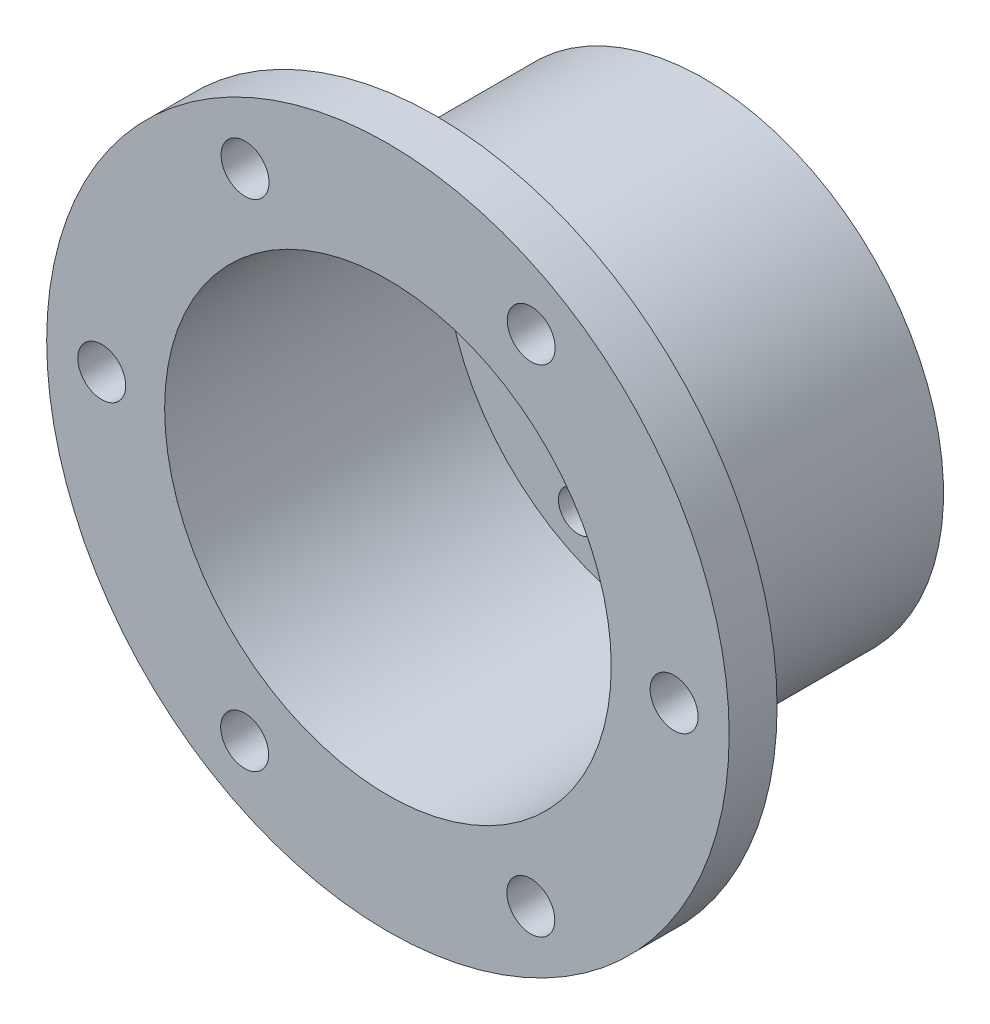
ISO-10303-21;
HEADER;
FILE_DESCRIPTION(('STEP AP214'),'2;1');
FILE_NAME('part.step','',(''),(''),'','','');
FILE_SCHEMA(('AUTOMOTIVE_DESIGN { 1 0 10303 214 1 1 1 1 }'));
ENDSEC;
DATA;
#1=APPLICATION_CONTEXT('core data for automotive mechanical design processes');
#2=APPLICATION_PROTOCOL_DEFINITION('international standard','automotive_design',2000,#1);
#3=PRODUCT_CONTEXT('',#1,'mechanical');
#4=PRODUCT('Part','Part','',(#3));
#5=PRODUCT_RELATED_PRODUCT_CATEGORY('part','',(#4));
#6=PRODUCT_DEFINITION_FORMATION('','',#4);
#7=PRODUCT_DEFINITION_CONTEXT('part definition',#1,'design');
#8=PRODUCT_DEFINITION('design','',#6,#7);
#9=PRODUCT_DEFINITION_SHAPE('','',#8);
#10=(LENGTH_UNIT() NAMED_UNIT(*) SI_UNIT(.MILLI.,.METRE.));
#11=(NAMED_UNIT(*) PLANE_ANGLE_UNIT() SI_UNIT($,.RADIAN.));
#12=(NAMED_UNIT(*) SI_UNIT($,.STERADIAN.) SOLID_ANGLE_UNIT());
#13=UNCERTAINTY_MEASURE_WITH_UNIT(LENGTH_MEASURE(1.E-05),#10,'distance_accuracy_value','');
#14=(GEOMETRIC_REPRESENTATION_CONTEXT(3) GLOBAL_UNCERTAINTY_ASSIGNED_CONTEXT((#13)) GLOBAL_UNIT_ASSIGNED_CONTEXT((#10,
#11,#12)) REPRESENTATION_CONTEXT('',''));
#15=CARTESIAN_POINT('',(0.,0.,0.));
#16=DIRECTION('',(0.,0.,1.));
#17=DIRECTION('',(1.,0.,0.));
#18=AXIS2_PLACEMENT_3D('',#15,#16,#17);
#19=CARTESIAN_POINT('',(0.,0.,0.));
#20=DIRECTION('',(0.,0.,1.));
#21=DIRECTION('',(1.,0.,0.));
#22=AXIS2_PLACEMENT_3D('',#19,#20,#21);
#23=PLANE('',#22);
#24=CARTESIAN_POINT('',(0.,-7.,0.));
#25=DIRECTION('',(0.,0.,-1.));
#26=DIRECTION('',(-1.,0.,0.));
#27=AXIS2_PLACEMENT_3D('',#24,#25,#26);
#28=CIRCLE('',#27,6.15);
#29=CARTESIAN_POINT('',(-6.15,-7.,0.));
#30=VERTEX_POINT('',#29);
#31=EDGE_CURVE('E78',#30,#30,#28,.T.);
#32=ORIENTED_EDGE('',*,*,#31,.F.);
#33=EDGE_LOOP('',(#32));
#34=FACE_BOUND('',#33,.T.);
#35=CARTESIAN_POINT('',(15.4976392749241,0.270512299777895,0.));
#36=DIRECTION('',(0.,0.,-1.));
#37=DIRECTION('',(-1.,0.,0.));
#38=AXIS2_PLACEMENT_3D('',#35,#36,#37);
#39=CIRCLE('',#38,1.65);
#40=CARTESIAN_POINT('',(13.8476392749241,0.270512299777895,0.));
#41=VERTEX_POINT('',#40);
#42=EDGE_CURVE('E113',#41,#41,#39,.T.);
#43=ORIENTED_EDGE('',*,*,#42,.F.);
#44=EDGE_LOOP('',(#43));
#45=FACE_BOUND('',#44,.T.);
#46=CARTESIAN_POINT('',(7.51454911381823,13.5566054606606,0.));
#47=DIRECTION('',(0.,0.,-1.));
#48=DIRECTION('',(-1.,0.,0.));
#49=AXIS2_PLACEMENT_3D('',#46,#47,#48);
#50=CIRCLE('',#49,1.65);
#51=CARTESIAN_POINT('',(5.86454911381823,13.5566054606606,0.));
#52=VERTEX_POINT('',#51);
#53=EDGE_CURVE('E107',#52,#52,#50,.T.);
#54=ORIENTED_EDGE('',*,*,#53,.F.);
#55=EDGE_LOOP('',(#54));
#56=FACE_BOUND('',#55,.T.);
#57=CARTESIAN_POINT('',(-7.98309016110584,13.2860931608827,0.));
#58=DIRECTION('',(0.,0.,-1.));
#59=DIRECTION('',(-1.,0.,0.));
#60=AXIS2_PLACEMENT_3D('',#57,#58,#59);
#61=CIRCLE('',#60,1.65);
#62=CARTESIAN_POINT('',(-9.63309016110584,13.2860931608827,0.));
#63=VERTEX_POINT('',#62);
#64=EDGE_CURVE('E101',#63,#63,#61,.T.);
#65=ORIENTED_EDGE('',*,*,#64,.F.);
#66=EDGE_LOOP('',(#65));
#67=FACE_BOUND('',#66,.T.);
#68=CARTESIAN_POINT('',(-15.4976392749241,-0.270512299777893,0.));
#69=DIRECTION('',(0.,0.,-1.));
#70=DIRECTION('',(-1.,0.,0.));
#71=AXIS2_PLACEMENT_3D('',#68,#69,#70);
#72=CIRCLE('',#71,1.65);
#73=CARTESIAN_POINT('',(-17.1476392749241,-0.270512299777893,0.));
#74=VERTEX_POINT('',#73);
#75=EDGE_CURVE('E95',#74,#74,#72,.T.);
#76=ORIENTED_EDGE('',*,*,#75,.F.);
#77=EDGE_LOOP('',(#76));
#78=FACE_BOUND('',#77,.T.);
#79=CARTESIAN_POINT('',(-7.51454911381823,-13.5566054606606,0.));
#80=DIRECTION('',(0.,0.,-1.));
#81=DIRECTION('',(-1.,0.,0.));
#82=AXIS2_PLACEMENT_3D('',#79,#80,#81);
#83=CIRCLE('',#82,1.65);
#84=CARTESIAN_POINT('',(-9.16454911381823,-13.5566054606606,0.));
#85=VERTEX_POINT('',#84);
#86=EDGE_CURVE('E89',#85,#85,#83,.T.);
#87=ORIENTED_EDGE('',*,*,#86,.F.);
#88=EDGE_LOOP('',(#87));
#89=FACE_BOUND('',#88,.T.);
#90=CARTESIAN_POINT('',(7.98309016110583,-13.2860931608827,0.));
#91=DIRECTION('',(0.,0.,-1.));
#92=DIRECTION('',(-1.,0.,0.));
#93=AXIS2_PLACEMENT_3D('',#90,#91,#92);
#94=CIRCLE('',#93,1.65);
#95=CARTESIAN_POINT('',(6.33309016110583,-13.2860931608827,0.));
#96=VERTEX_POINT('',#95);
#97=EDGE_CURVE('E52',#96,#96,#94,.T.);
#98=ORIENTED_EDGE('',*,*,#97,.F.);
#99=EDGE_LOOP('',(#98));
#100=FACE_BOUND('',#99,.T.);
#101=CARTESIAN_POINT('',(0.,0.,0.));
#102=DIRECTION('',(0.,0.,-1.));
#103=DIRECTION('',(-1.,0.,0.));
#104=AXIS2_PLACEMENT_3D('',#101,#102,#103);
#105=CIRCLE('',#104,20.);
#106=CARTESIAN_POINT('',(-20.,0.,0.));
#107=VERTEX_POINT('',#106);
#108=EDGE_CURVE('E125',#107,#107,#105,.T.);
#109=ORIENTED_EDGE('',*,*,#108,.T.);
#110=EDGE_LOOP('',(#109));
#111=FACE_BOUND('',#110,.T.);
#112=ADVANCED_FACE('F31',(#34,#45,#56,#67,#78,#89,#100,#111),#23,.F.);
#113=CARTESIAN_POINT('',(0.,0.,26.4));
#114=DIRECTION('',(0.,0.,-1.));
#115=DIRECTION('',(-1.,0.,0.));
#116=AXIS2_PLACEMENT_3D('',#113,#114,#115);
#117=CYLINDRICAL_SURFACE('',#116,18.65);
#118=CARTESIAN_POINT('',(0.,0.,26.4));
#119=DIRECTION('',(0.,0.,1.));
#120=DIRECTION('',(1.,0.,0.));
#121=AXIS2_PLACEMENT_3D('',#118,#119,#120);
#122=CIRCLE('',#121,18.65);
#123=CARTESIAN_POINT('',(18.65,0.,26.4));
#124=VERTEX_POINT('',#123);
#125=EDGE_CURVE('E42',#124,#124,#122,.T.);
#126=ORIENTED_EDGE('',*,*,#125,.T.);
#127=EDGE_LOOP('',(#126));
#128=FACE_BOUND('',#127,.T.);
#129=CARTESIAN_POINT('',(0.,0.,3.));
#130=DIRECTION('',(0.,0.,-1.));
#131=DIRECTION('',(-1.,0.,0.));
#132=AXIS2_PLACEMENT_3D('',#129,#130,#131);
#133=CIRCLE('',#132,18.65);
#134=CARTESIAN_POINT('',(-18.65,0.,3.));
#135=VERTEX_POINT('',#134);
#136=EDGE_CURVE('E46',#135,#135,#133,.T.);
#137=ORIENTED_EDGE('',*,*,#136,.T.);
#138=EDGE_LOOP('',(#137));
#139=FACE_BOUND('',#138,.T.);
#140=ADVANCED_FACE('F156',(#128,#139),#117,.F.);
#141=CARTESIAN_POINT('',(0.,0.,26.4));
#142=DIRECTION('',(0.,0.,1.));
#143=DIRECTION('',(1.,0.,0.));
#144=AXIS2_PLACEMENT_3D('',#141,#142,#143);
#145=PLANE('',#144);
#146=CARTESIAN_POINT('',(-23.8999999999988,0.0193012928345112,26.4));
#147=DIRECTION('',(0.,0.,1.));
#148=DIRECTION('',(1.,0.,0.));
#149=AXIS2_PLACEMENT_3D('',#146,#147,#148);
#150=CIRCLE('',#149,2.);
#151=CARTESIAN_POINT('',(-21.8999999999988,0.0193012928345112,26.4));
#152=VERTEX_POINT('',#151);
#153=EDGE_CURVE('E121',#152,#152,#150,.T.);
#154=ORIENTED_EDGE('',*,*,#153,.F.);
#155=EDGE_LOOP('',(#154));
#156=FACE_BOUND('',#155,.T.);
#157=CARTESIAN_POINT('',(-11.9667154099194,-20.6883565040301,26.4));
#158=DIRECTION('',(0.,0.,1.));
#159=DIRECTION('',(1.,0.,0.));
#160=AXIS2_PLACEMENT_3D('',#157,#158,#159);
#161=CIRCLE('',#160,2.);
#162=CARTESIAN_POINT('',(-9.96671540991937,-20.6883565040301,26.4));
#163=VERTEX_POINT('',#162);
#164=EDGE_CURVE('E124',#163,#163,#161,.T.);
#165=ORIENTED_EDGE('',*,*,#164,.F.);
#166=EDGE_LOOP('',(#165));
#167=FACE_BOUND('',#166,.T.);
#168=CARTESIAN_POINT('',(11.93328459008,-20.7076577968643,26.4));
#169=DIRECTION('',(0.,0.,1.));
#170=DIRECTION('',(1.,0.,0.));
#171=AXIS2_PLACEMENT_3D('',#168,#169,#170);
#172=CIRCLE('',#171,2.);
#173=CARTESIAN_POINT('',(13.93328459008,-20.7076577968643,26.4));
#174=VERTEX_POINT('',#173);
#175=EDGE_CURVE('E128',#174,#174,#172,.T.);
#176=ORIENTED_EDGE('',*,*,#175,.F.);
#177=EDGE_LOOP('',(#176));
#178=FACE_BOUND('',#177,.T.);
#179=CARTESIAN_POINT('',(23.9,-0.019301292833822,26.4));
#180=DIRECTION('',(0.,0.,1.));
#181=DIRECTION('',(1.,0.,0.));
#182=AXIS2_PLACEMENT_3D('',#179,#180,#181);
#183=CIRCLE('',#182,2.);
#184=CARTESIAN_POINT('',(25.9,-0.019301292833822,26.4));
#185=VERTEX_POINT('',#184);
#186=EDGE_CURVE('E131',#185,#185,#183,.T.);
#187=ORIENTED_EDGE('',*,*,#186,.F.);
#188=EDGE_LOOP('',(#187));
#189=FACE_BOUND('',#188,.T.);
#190=CARTESIAN_POINT('',(11.9667154099206,20.6883565040308,26.4));
#191=DIRECTION('',(0.,0.,1.));
#192=DIRECTION('',(1.,0.,0.));
#193=AXIS2_PLACEMENT_3D('',#190,#191,#192);
#194=CIRCLE('',#193,2.);
#195=CARTESIAN_POINT('',(13.9667154099206,20.6883565040308,26.4));
#196=VERTEX_POINT('',#195);
#197=EDGE_CURVE('E120',#196,#196,#194,.T.);
#198=ORIENTED_EDGE('',*,*,#197,.F.);
#199=EDGE_LOOP('',(#198));
#200=FACE_BOUND('',#199,.T.);
#201=CARTESIAN_POINT('',(-11.9332845900788,20.707657796865,26.4));
#202=DIRECTION('',(0.,0.,1.));
#203=DIRECTION('',(1.,0.,0.));
#204=AXIS2_PLACEMENT_3D('',#201,#202,#203);
#205=CIRCLE('',#204,2.);
#206=CARTESIAN_POINT('',(-9.93328459007882,20.707657796865,26.4));
#207=VERTEX_POINT('',#206);
#208=EDGE_CURVE('E67',#207,#207,#205,.T.);
#209=ORIENTED_EDGE('',*,*,#208,.F.);
#210=EDGE_LOOP('',(#209));
#211=FACE_BOUND('',#210,.T.);
#212=ORIENTED_EDGE('',*,*,#125,.F.);
#213=EDGE_LOOP('',(#212));
#214=FACE_BOUND('',#213,.T.);
#215=CARTESIAN_POINT('',(0.,0.,26.4));
#216=DIRECTION('',(0.,0.,1.));
#217=DIRECTION('',(1.,0.,0.));
#218=AXIS2_PLACEMENT_3D('',#215,#216,#217);
#219=CIRCLE('',#218,28.5);
#220=CARTESIAN_POINT('',(28.5,0.,26.4));
#221=VERTEX_POINT('',#220);
#222=EDGE_CURVE('E72',#221,#221,#219,.T.);
#223=ORIENTED_EDGE('',*,*,#222,.T.);
#224=EDGE_LOOP('',(#223));
#225=FACE_BOUND('',#224,.T.);
#226=ADVANCED_FACE('F161',(#156,#167,#178,#189,#200,#211,#214,#225),#145,.T.);
#227=CARTESIAN_POINT('',(0.,0.,3.));
#228=DIRECTION('',(0.,0.,-1.));
#229=DIRECTION('',(-1.,0.,0.));
#230=AXIS2_PLACEMENT_3D('',#227,#228,#229);
#231=PLANE('',#230);
#232=CARTESIAN_POINT('',(7.98309016110583,-13.2860931608827,3.));
#233=DIRECTION('',(0.,0.,-1.));
#234=DIRECTION('',(-1.,0.,0.));
#235=AXIS2_PLACEMENT_3D('',#232,#233,#234);
#236=CIRCLE('',#235,1.65);
#237=CARTESIAN_POINT('',(6.33309016110583,-13.2860931608827,3.));
#238=VERTEX_POINT('',#237);
#239=EDGE_CURVE('E86',#238,#238,#236,.T.);
#240=ORIENTED_EDGE('',*,*,#239,.T.);
#241=EDGE_LOOP('',(#240));
#242=FACE_BOUND('',#241,.T.);
#243=CARTESIAN_POINT('',(-7.51454911381823,-13.5566054606606,3.));
#244=DIRECTION('',(0.,0.,-1.));
#245=DIRECTION('',(-1.,0.,0.));
#246=AXIS2_PLACEMENT_3D('',#243,#244,#245);
#247=CIRCLE('',#246,1.65);
#248=CARTESIAN_POINT('',(-9.16454911381823,-13.5566054606606,3.));
#249=VERTEX_POINT('',#248);
#250=EDGE_CURVE('E92',#249,#249,#247,.T.);
#251=ORIENTED_EDGE('',*,*,#250,.T.);
#252=EDGE_LOOP('',(#251));
#253=FACE_BOUND('',#252,.T.);
#254=CARTESIAN_POINT('',(-15.4976392749241,-0.270512299777893,3.));
#255=DIRECTION('',(0.,0.,-1.));
#256=DIRECTION('',(-1.,0.,0.));
#257=AXIS2_PLACEMENT_3D('',#254,#255,#256);
#258=CIRCLE('',#257,1.65);
#259=CARTESIAN_POINT('',(-17.1476392749241,-0.270512299777893,3.));
#260=VERTEX_POINT('',#259);
#261=EDGE_CURVE('E98',#260,#260,#258,.T.);
#262=ORIENTED_EDGE('',*,*,#261,.T.);
#263=EDGE_LOOP('',(#262));
#264=FACE_BOUND('',#263,.T.);
#265=CARTESIAN_POINT('',(-7.98309016110584,13.2860931608827,3.));
#266=DIRECTION('',(0.,0.,-1.));
#267=DIRECTION('',(-1.,0.,0.));
#268=AXIS2_PLACEMENT_3D('',#265,#266,#267);
#269=CIRCLE('',#268,1.65);
#270=CARTESIAN_POINT('',(-9.63309016110584,13.2860931608827,3.));
#271=VERTEX_POINT('',#270);
#272=EDGE_CURVE('E104',#271,#271,#269,.T.);
#273=ORIENTED_EDGE('',*,*,#272,.T.);
#274=EDGE_LOOP('',(#273));
#275=FACE_BOUND('',#274,.T.);
#276=CARTESIAN_POINT('',(7.51454911381823,13.5566054606606,3.));
#277=DIRECTION('',(0.,0.,-1.));
#278=DIRECTION('',(-1.,0.,0.));
#279=AXIS2_PLACEMENT_3D('',#276,#277,#278);
#280=CIRCLE('',#279,1.65);
#281=CARTESIAN_POINT('',(5.86454911381823,13.5566054606606,3.));
#282=VERTEX_POINT('',#281);
#283=EDGE_CURVE('E110',#282,#282,#280,.T.);
#284=ORIENTED_EDGE('',*,*,#283,.T.);
#285=EDGE_LOOP('',(#284));
#286=FACE_BOUND('',#285,.T.);
#287=CARTESIAN_POINT('',(15.4976392749241,0.270512299777895,3.));
#288=DIRECTION('',(0.,0.,-1.));
#289=DIRECTION('',(-1.,0.,0.));
#290=AXIS2_PLACEMENT_3D('',#287,#288,#289);
#291=CIRCLE('',#290,1.65);
#292=CARTESIAN_POINT('',(13.8476392749241,0.270512299777895,3.));
#293=VERTEX_POINT('',#292);
#294=EDGE_CURVE('E81',#293,#293,#291,.T.);
#295=ORIENTED_EDGE('',*,*,#294,.T.);
#296=EDGE_LOOP('',(#295));
#297=FACE_BOUND('',#296,.T.);
#298=CARTESIAN_POINT('',(0.,-7.,3.));
#299=DIRECTION('',(0.,0.,-1.));
#300=DIRECTION('',(-1.,0.,0.));
#301=AXIS2_PLACEMENT_3D('',#298,#299,#300);
#302=CIRCLE('',#301,6.15);
#303=CARTESIAN_POINT('',(-6.15,-7.,3.));
#304=VERTEX_POINT('',#303);
#305=EDGE_CURVE('E75',#304,#304,#302,.T.);
#306=ORIENTED_EDGE('',*,*,#305,.T.);
#307=EDGE_LOOP('',(#306));
#308=FACE_BOUND('',#307,.T.);
#309=ORIENTED_EDGE('',*,*,#136,.F.);
#310=EDGE_LOOP('',(#309));
#311=FACE_BOUND('',#310,.T.);
#312=ADVANCED_FACE('F168',(#242,#253,#264,#275,#286,#297,#308,#311),#231,.F.);
#313=CARTESIAN_POINT('',(0.,0.,22.4));
#314=DIRECTION('',(0.,0.,1.));
#315=DIRECTION('',(1.,0.,0.));
#316=AXIS2_PLACEMENT_3D('',#313,#314,#315);
#317=CYLINDRICAL_SURFACE('',#316,28.5);
#318=CARTESIAN_POINT('',(0.,0.,22.4));
#319=DIRECTION('',(0.,0.,1.));
#320=DIRECTION('',(1.,0.,0.));
#321=AXIS2_PLACEMENT_3D('',#318,#319,#320);
#322=CIRCLE('',#321,28.5);
#323=CARTESIAN_POINT('',(28.5,0.,22.4));
#324=VERTEX_POINT('',#323);
#325=EDGE_CURVE('E71',#324,#324,#322,.T.);
#326=ORIENTED_EDGE('',*,*,#325,.T.);
#327=EDGE_LOOP('',(#326));
#328=FACE_BOUND('',#327,.T.);
#329=ORIENTED_EDGE('',*,*,#222,.F.);
#330=EDGE_LOOP('',(#329));
#331=FACE_BOUND('',#330,.T.);
#332=ADVANCED_FACE('F173',(#328,#331),#317,.T.);
#333=CARTESIAN_POINT('',(0.,0.,22.4));
#334=DIRECTION('',(0.,0.,1.));
#335=DIRECTION('',(1.,0.,0.));
#336=AXIS2_PLACEMENT_3D('',#333,#334,#335);
#337=PLANE('',#336);
#338=CARTESIAN_POINT('',(0.,0.,22.4));
#339=DIRECTION('',(0.,0.,1.));
#340=DIRECTION('',(1.,0.,0.));
#341=AXIS2_PLACEMENT_3D('',#338,#339,#340);
#342=CIRCLE('',#341,21.);
#343=CARTESIAN_POINT('',(21.,0.,22.4));
#344=VERTEX_POINT('',#343);
#345=EDGE_CURVE('E10',#344,#344,#342,.T.);
#346=ORIENTED_EDGE('',*,*,#345,.T.);
#347=EDGE_LOOP('',(#346));
#348=FACE_BOUND('',#347,.T.);
#349=CARTESIAN_POINT('',(-23.8999999999988,0.0193012928345112,22.4));
#350=DIRECTION('',(0.,0.,1.));
#351=DIRECTION('',(1.,0.,0.));
#352=AXIS2_PLACEMENT_3D('',#349,#350,#351);
#353=CIRCLE('',#352,2.);
#354=CARTESIAN_POINT('',(-21.8999999999988,0.0193012928345112,22.4));
#355=VERTEX_POINT('',#354);
#356=EDGE_CURVE('E49',#355,#355,#353,.T.);
#357=ORIENTED_EDGE('',*,*,#356,.T.);
#358=EDGE_LOOP('',(#357));
#359=FACE_BOUND('',#358,.T.);
#360=CARTESIAN_POINT('',(-11.9667154099194,-20.6883565040301,22.4));
#361=DIRECTION('',(0.,0.,1.));
#362=DIRECTION('',(1.,0.,0.));
#363=AXIS2_PLACEMENT_3D('',#360,#361,#362);
#364=CIRCLE('',#363,2.);
#365=CARTESIAN_POINT('',(-9.96671540991937,-20.6883565040301,22.4));
#366=VERTEX_POINT('',#365);
#367=EDGE_CURVE('E53',#366,#366,#364,.T.);
#368=ORIENTED_EDGE('',*,*,#367,.T.);
#369=EDGE_LOOP('',(#368));
#370=FACE_BOUND('',#369,.T.);
#371=CARTESIAN_POINT('',(11.93328459008,-20.7076577968643,22.4));
#372=DIRECTION('',(0.,0.,1.));
#373=DIRECTION('',(1.,0.,0.));
#374=AXIS2_PLACEMENT_3D('',#371,#372,#373);
#375=CIRCLE('',#374,2.);
#376=CARTESIAN_POINT('',(13.93328459008,-20.7076577968643,22.4));
#377=VERTEX_POINT('',#376);
#378=EDGE_CURVE('E56',#377,#377,#375,.T.);
#379=ORIENTED_EDGE('',*,*,#378,.T.);
#380=EDGE_LOOP('',(#379));
#381=FACE_BOUND('',#380,.T.);
#382=CARTESIAN_POINT('',(23.9,-0.019301292833822,22.4));
#383=DIRECTION('',(0.,0.,1.));
#384=DIRECTION('',(1.,0.,0.));
#385=AXIS2_PLACEMENT_3D('',#382,#383,#384);
#386=CIRCLE('',#385,2.);
#387=CARTESIAN_POINT('',(25.9,-0.019301292833822,22.4));
#388=VERTEX_POINT('',#387);
#389=EDGE_CURVE('E59',#388,#388,#386,.T.);
#390=ORIENTED_EDGE('',*,*,#389,.T.);
#391=EDGE_LOOP('',(#390));
#392=FACE_BOUND('',#391,.T.);
#393=CARTESIAN_POINT('',(11.9667154099206,20.6883565040308,22.4));
#394=DIRECTION('',(0.,0.,1.));
#395=DIRECTION('',(1.,0.,0.));
#396=AXIS2_PLACEMENT_3D('',#393,#394,#395);
#397=CIRCLE('',#396,2.);
#398=CARTESIAN_POINT('',(13.9667154099206,20.6883565040308,22.4));
#399=VERTEX_POINT('',#398);
#400=EDGE_CURVE('E62',#399,#399,#397,.T.);
#401=ORIENTED_EDGE('',*,*,#400,.T.);
#402=EDGE_LOOP('',(#401));
#403=FACE_BOUND('',#402,.T.);
#404=CARTESIAN_POINT('',(-11.9332845900788,20.707657796865,22.4));
#405=DIRECTION('',(0.,0.,1.));
#406=DIRECTION('',(1.,0.,0.));
#407=AXIS2_PLACEMENT_3D('',#404,#405,#406);
#408=CIRCLE('',#407,2.);
#409=CARTESIAN_POINT('',(-9.93328459007882,20.707657796865,22.4));
#410=VERTEX_POINT('',#409);
#411=EDGE_CURVE('E65',#410,#410,#408,.T.);
#412=ORIENTED_EDGE('',*,*,#411,.T.);
#413=EDGE_LOOP('',(#412));
#414=FACE_BOUND('',#413,.T.);
#415=ORIENTED_EDGE('',*,*,#325,.F.);
#416=EDGE_LOOP('',(#415));
#417=FACE_BOUND('',#416,.T.);
#418=ADVANCED_FACE('F177',(#348,#359,#370,#381,#392,#403,#414,#417),#337,.F.);
#419=CARTESIAN_POINT('',(0.,-7.,3.));
#420=DIRECTION('',(0.,0.,-1.));
#421=DIRECTION('',(-1.,0.,0.));
#422=AXIS2_PLACEMENT_3D('',#419,#420,#421);
#423=CYLINDRICAL_SURFACE('',#422,6.15);
#424=ORIENTED_EDGE('',*,*,#305,.F.);
#425=EDGE_LOOP('',(#424));
#426=FACE_BOUND('',#425,.T.);
#427=ORIENTED_EDGE('',*,*,#31,.T.);
#428=EDGE_LOOP('',(#427));
#429=FACE_BOUND('',#428,.T.);
#430=ADVANCED_FACE('F180',(#426,#429),#423,.F.);
#431=CARTESIAN_POINT('',(15.4976392749241,0.270512299777895,3.));
#432=DIRECTION('',(0.,0.,-1.));
#433=DIRECTION('',(-1.,0.,0.));
#434=AXIS2_PLACEMENT_3D('',#431,#432,#433);
#435=CYLINDRICAL_SURFACE('',#434,1.65);
#436=ORIENTED_EDGE('',*,*,#294,.F.);
#437=EDGE_LOOP('',(#436));
#438=FACE_BOUND('',#437,.T.);
#439=ORIENTED_EDGE('',*,*,#42,.T.);
#440=EDGE_LOOP('',(#439));
#441=FACE_BOUND('',#440,.T.);
#442=ADVANCED_FACE('F183',(#438,#441),#435,.F.);
#443=CARTESIAN_POINT('',(7.51454911381823,13.5566054606606,3.));
#444=DIRECTION('',(0.,0.,-1.));
#445=DIRECTION('',(-1.,0.,0.));
#446=AXIS2_PLACEMENT_3D('',#443,#444,#445);
#447=CYLINDRICAL_SURFACE('',#446,1.65);
#448=ORIENTED_EDGE('',*,*,#283,.F.);
#449=EDGE_LOOP('',(#448));
#450=FACE_BOUND('',#449,.T.);
#451=ORIENTED_EDGE('',*,*,#53,.T.);
#452=EDGE_LOOP('',(#451));
#453=FACE_BOUND('',#452,.T.);
#454=ADVANCED_FACE('F201',(#450,#453),#447,.F.);
#455=CARTESIAN_POINT('',(-7.98309016110584,13.2860931608827,3.));
#456=DIRECTION('',(0.,0.,-1.));
#457=DIRECTION('',(-1.,0.,0.));
#458=AXIS2_PLACEMENT_3D('',#455,#456,#457);
#459=CYLINDRICAL_SURFACE('',#458,1.65);
#460=ORIENTED_EDGE('',*,*,#272,.F.);
#461=EDGE_LOOP('',(#460));
#462=FACE_BOUND('',#461,.T.);
#463=ORIENTED_EDGE('',*,*,#64,.T.);
#464=EDGE_LOOP('',(#463));
#465=FACE_BOUND('',#464,.T.);
#466=ADVANCED_FACE('F197',(#462,#465),#459,.F.);
#467=CARTESIAN_POINT('',(-15.4976392749241,-0.270512299777893,3.));
#468=DIRECTION('',(0.,0.,-1.));
#469=DIRECTION('',(-1.,0.,0.));
#470=AXIS2_PLACEMENT_3D('',#467,#468,#469);
#471=CYLINDRICAL_SURFACE('',#470,1.65);
#472=ORIENTED_EDGE('',*,*,#261,.F.);
#473=EDGE_LOOP('',(#472));
#474=FACE_BOUND('',#473,.T.);
#475=ORIENTED_EDGE('',*,*,#75,.T.);
#476=EDGE_LOOP('',(#475));
#477=FACE_BOUND('',#476,.T.);
#478=ADVANCED_FACE('F193',(#474,#477),#471,.F.);
#479=CARTESIAN_POINT('',(-7.51454911381823,-13.5566054606606,3.));
#480=DIRECTION('',(0.,0.,-1.));
#481=DIRECTION('',(-1.,0.,0.));
#482=AXIS2_PLACEMENT_3D('',#479,#480,#481);
#483=CYLINDRICAL_SURFACE('',#482,1.65);
#484=ORIENTED_EDGE('',*,*,#250,.F.);
#485=EDGE_LOOP('',(#484));
#486=FACE_BOUND('',#485,.T.);
#487=ORIENTED_EDGE('',*,*,#86,.T.);
#488=EDGE_LOOP('',(#487));
#489=FACE_BOUND('',#488,.T.);
#490=ADVANCED_FACE('F189',(#486,#489),#483,.F.);
#491=CARTESIAN_POINT('',(7.98309016110583,-13.2860931608827,3.));
#492=DIRECTION('',(0.,0.,-1.));
#493=DIRECTION('',(-1.,0.,0.));
#494=AXIS2_PLACEMENT_3D('',#491,#492,#493);
#495=CYLINDRICAL_SURFACE('',#494,1.65);
#496=ORIENTED_EDGE('',*,*,#239,.F.);
#497=EDGE_LOOP('',(#496));
#498=FACE_BOUND('',#497,.T.);
#499=ORIENTED_EDGE('',*,*,#97,.T.);
#500=EDGE_LOOP('',(#499));
#501=FACE_BOUND('',#500,.T.);
#502=ADVANCED_FACE('F185',(#498,#501),#495,.F.);
#503=CARTESIAN_POINT('',(-11.9332845900788,20.707657796865,0.));
#504=DIRECTION('',(0.,0.,1.));
#505=DIRECTION('',(1.,0.,0.));
#506=AXIS2_PLACEMENT_3D('',#503,#504,#505);
#507=CYLINDRICAL_SURFACE('',#506,2.);
#508=ORIENTED_EDGE('',*,*,#208,.T.);
#509=EDGE_LOOP('',(#508));
#510=FACE_BOUND('',#509,.T.);
#511=ORIENTED_EDGE('',*,*,#411,.F.);
#512=EDGE_LOOP('',(#511));
#513=FACE_BOUND('',#512,.T.);
#514=ADVANCED_FACE('F188',(#510,#513),#507,.F.);
#515=CARTESIAN_POINT('',(11.9667154099206,20.6883565040308,0.));
#516=DIRECTION('',(0.,0.,1.));
#517=DIRECTION('',(1.,0.,0.));
#518=AXIS2_PLACEMENT_3D('',#515,#516,#517);
#519=CYLINDRICAL_SURFACE('',#518,2.);
#520=ORIENTED_EDGE('',*,*,#197,.T.);
#521=EDGE_LOOP('',(#520));
#522=FACE_BOUND('',#521,.T.);
#523=ORIENTED_EDGE('',*,*,#400,.F.);
#524=EDGE_LOOP('',(#523));
#525=FACE_BOUND('',#524,.T.);
#526=ADVANCED_FACE('F210',(#522,#525),#519,.F.);
#527=CARTESIAN_POINT('',(23.9,-0.019301292833822,0.));
#528=DIRECTION('',(0.,0.,1.));
#529=DIRECTION('',(1.,0.,0.));
#530=AXIS2_PLACEMENT_3D('',#527,#528,#529);
#531=CYLINDRICAL_SURFACE('',#530,2.);
#532=ORIENTED_EDGE('',*,*,#186,.T.);
#533=EDGE_LOOP('',(#532));
#534=FACE_BOUND('',#533,.T.);
#535=ORIENTED_EDGE('',*,*,#389,.F.);
#536=EDGE_LOOP('',(#535));
#537=FACE_BOUND('',#536,.T.);
#538=ADVANCED_FACE('F219',(#534,#537),#531,.F.);
#539=CARTESIAN_POINT('',(11.93328459008,-20.7076577968643,0.));
#540=DIRECTION('',(0.,0.,1.));
#541=DIRECTION('',(1.,0.,0.));
#542=AXIS2_PLACEMENT_3D('',#539,#540,#541);
#543=CYLINDRICAL_SURFACE('',#542,2.);
#544=ORIENTED_EDGE('',*,*,#175,.T.);
#545=EDGE_LOOP('',(#544));
#546=FACE_BOUND('',#545,.T.);
#547=ORIENTED_EDGE('',*,*,#378,.F.);
#548=EDGE_LOOP('',(#547));
#549=FACE_BOUND('',#548,.T.);
#550=ADVANCED_FACE('F215',(#546,#549),#543,.F.);
#551=CARTESIAN_POINT('',(-11.9667154099194,-20.6883565040301,0.));
#552=DIRECTION('',(0.,0.,1.));
#553=DIRECTION('',(1.,0.,0.));
#554=AXIS2_PLACEMENT_3D('',#551,#552,#553);
#555=CYLINDRICAL_SURFACE('',#554,2.);
#556=ORIENTED_EDGE('',*,*,#164,.T.);
#557=EDGE_LOOP('',(#556));
#558=FACE_BOUND('',#557,.T.);
#559=ORIENTED_EDGE('',*,*,#367,.F.);
#560=EDGE_LOOP('',(#559));
#561=FACE_BOUND('',#560,.T.);
#562=ADVANCED_FACE('F151',(#558,#561),#555,.F.);
#563=CARTESIAN_POINT('',(-23.8999999999988,0.0193012928345112,0.));
#564=DIRECTION('',(0.,0.,1.));
#565=DIRECTION('',(1.,0.,0.));
#566=AXIS2_PLACEMENT_3D('',#563,#564,#565);
#567=CYLINDRICAL_SURFACE('',#566,2.);
#568=ORIENTED_EDGE('',*,*,#153,.T.);
#569=EDGE_LOOP('',(#568));
#570=FACE_BOUND('',#569,.T.);
#571=ORIENTED_EDGE('',*,*,#356,.F.);
#572=EDGE_LOOP('',(#571));
#573=FACE_BOUND('',#572,.T.);
#574=ADVANCED_FACE('F142',(#570,#573),#567,.F.);
#575=CARTESIAN_POINT('',(0.,0.,22.4));
#576=DIRECTION('',(0.,0.,-1.));
#577=DIRECTION('',(-1.,0.,0.));
#578=AXIS2_PLACEMENT_3D('',#575,#576,#577);
#579=CYLINDRICAL_SURFACE('',#578,20.);
#580=CARTESIAN_POINT('',(0.,0.,21.4));
#581=DIRECTION('',(0.,0.,1.));
#582=DIRECTION('',(1.,0.,0.));
#583=AXIS2_PLACEMENT_3D('',#580,#581,#582);
#584=CIRCLE('',#583,20.);
#585=CARTESIAN_POINT('',(20.,0.,21.4));
#586=VERTEX_POINT('',#585);
#587=EDGE_CURVE('E38',#586,#586,#584,.F.);
#588=ORIENTED_EDGE('',*,*,#587,.T.);
#589=EDGE_LOOP('',(#588));
#590=FACE_BOUND('',#589,.T.);
#591=ORIENTED_EDGE('',*,*,#108,.F.);
#592=EDGE_LOOP('',(#591));
#593=FACE_BOUND('',#592,.T.);
#594=ADVANCED_FACE('F140',(#590,#593),#579,.T.);
#595=CARTESIAN_POINT('',(0.,0.,21.4));
#596=DIRECTION('',(0.,0.,1.));
#597=DIRECTION('',(1.,0.,0.));
#598=AXIS2_PLACEMENT_3D('',#595,#596,#597);
#599=TOROIDAL_SURFACE('',#598,21.,1.);
#600=ORIENTED_EDGE('',*,*,#345,.F.);
#601=EDGE_LOOP('',(#600));
#602=FACE_BOUND('',#601,.T.);
#603=ORIENTED_EDGE('',*,*,#587,.F.);
#604=EDGE_LOOP('',(#603));
#605=FACE_BOUND('',#604,.T.);
#606=ADVANCED_FACE('F33',(#602,#605),#599,.F.);
#607=CLOSED_SHELL('',(#112,#140,#226,#312,#332,#418,#430,#442,#454,#466,#478,#490,#502,#514,
#526,#538,#550,#562,#574,#594,#606));
#608=MANIFOLD_SOLID_BREP('B2',#607);
#609=ADVANCED_BREP_SHAPE_REPRESENTATION('',(#18,#608),#14);
#610=SHAPE_DEFINITION_REPRESENTATION(#9,#609);
ENDSEC;
END-ISO-10303-21;
